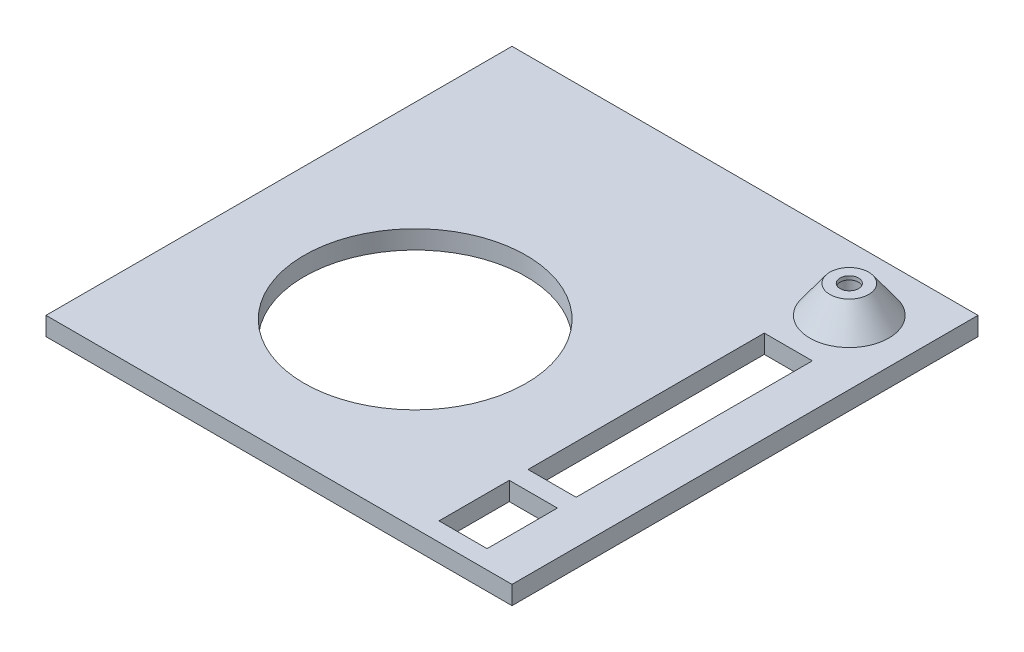
ISO-10303-21;
HEADER;
FILE_DESCRIPTION(('STEP AP214'),'2;1');
FILE_NAME('part.step','',(''),(''),'','','');
FILE_SCHEMA(('AUTOMOTIVE_DESIGN { 1 0 10303 214 1 1 1 1 }'));
ENDSEC;
DATA;
#1=APPLICATION_CONTEXT('core data for automotive mechanical design processes');
#2=APPLICATION_PROTOCOL_DEFINITION('international standard','automotive_design',2000,#1);
#3=PRODUCT_CONTEXT('',#1,'mechanical');
#4=PRODUCT('Part','Part','',(#3));
#5=PRODUCT_RELATED_PRODUCT_CATEGORY('part','',(#4));
#6=PRODUCT_DEFINITION_FORMATION('','',#4);
#7=PRODUCT_DEFINITION_CONTEXT('part definition',#1,'design');
#8=PRODUCT_DEFINITION('design','',#6,#7);
#9=PRODUCT_DEFINITION_SHAPE('','',#8);
#10=(LENGTH_UNIT() NAMED_UNIT(*) SI_UNIT(.MILLI.,.METRE.));
#11=(NAMED_UNIT(*) PLANE_ANGLE_UNIT() SI_UNIT($,.RADIAN.));
#12=(NAMED_UNIT(*) SI_UNIT($,.STERADIAN.) SOLID_ANGLE_UNIT());
#13=UNCERTAINTY_MEASURE_WITH_UNIT(LENGTH_MEASURE(1.E-05),#10,'distance_accuracy_value','');
#14=(GEOMETRIC_REPRESENTATION_CONTEXT(3) GLOBAL_UNCERTAINTY_ASSIGNED_CONTEXT((#13)) GLOBAL_UNIT_ASSIGNED_CONTEXT((#10,
#11,#12)) REPRESENTATION_CONTEXT('',''));
#15=CARTESIAN_POINT('',(0.,0.,0.));
#16=DIRECTION('',(0.,0.,1.));
#17=DIRECTION('',(1.,0.,0.));
#18=AXIS2_PLACEMENT_3D('',#15,#16,#17);
#19=CARTESIAN_POINT('',(0.,5.,0.));
#20=DIRECTION('',(0.,-1.,0.));
#21=DIRECTION('',(0.,0.,-1.));
#22=AXIS2_PLACEMENT_3D('',#19,#20,#21);
#23=PLANE('',#22);
#24=CARTESIAN_POINT('',(50.8371550320844,5.,-48.9745839886971));
#25=DIRECTION('',(0.,1.,0.));
#26=DIRECTION('',(0.,0.,1.));
#27=AXIS2_PLACEMENT_3D('',#24,#25,#26);
#28=CIRCLE('',#27,30.);
#29=CARTESIAN_POINT('',(50.8371550320844,5.,-18.9745839886971));
#30=VERTEX_POINT('',#29);
#31=EDGE_CURVE('E161',#30,#30,#28,.T.);
#32=ORIENTED_EDGE('',*,*,#31,.F.);
#33=EDGE_LOOP('',(#32));
#34=FACE_BOUND('',#33,.T.);
#35=DIRECTION('',(0.,0.,1.));
#36=VECTOR('',#35,1.);
#37=CARTESIAN_POINT('',(0.,5.,0.));
#38=LINE('',#37,#36);
#39=CARTESIAN_POINT('',(0.,5.,-126.));
#40=VERTEX_POINT('',#39);
#41=CARTESIAN_POINT('',(0.,5.,0.));
#42=VERTEX_POINT('',#41);
#43=EDGE_CURVE('E240',#40,#42,#38,.T.);
#44=ORIENTED_EDGE('',*,*,#43,.T.);
#45=DIRECTION('',(1.,0.,0.));
#46=VECTOR('',#45,1.);
#47=CARTESIAN_POINT('',(0.,5.,0.));
#48=LINE('',#47,#46);
#49=CARTESIAN_POINT('',(126.,5.,0.));
#50=VERTEX_POINT('',#49);
#51=EDGE_CURVE('E244',#42,#50,#48,.T.);
#52=ORIENTED_EDGE('',*,*,#51,.T.);
#53=DIRECTION('',(0.,0.,-1.));
#54=VECTOR('',#53,1.);
#55=CARTESIAN_POINT('',(126.,5.,0.));
#56=LINE('',#55,#54);
#57=CARTESIAN_POINT('',(126.,5.,-126.));
#58=VERTEX_POINT('',#57);
#59=EDGE_CURVE('E248',#50,#58,#56,.T.);
#60=ORIENTED_EDGE('',*,*,#59,.T.);
#61=DIRECTION('',(-1.,0.,0.));
#62=VECTOR('',#61,1.);
#63=CARTESIAN_POINT('',(0.,5.,-126.));
#64=LINE('',#63,#62);
#65=EDGE_CURVE('E251',#58,#40,#64,.T.);
#66=ORIENTED_EDGE('',*,*,#65,.T.);
#67=EDGE_LOOP('',(#44,#52,#60,#66));
#68=FACE_BOUND('',#67,.T.);
#69=CARTESIAN_POINT('',(108.6,5.,-108.6));
#70=DIRECTION('',(0.,-1.,0.));
#71=DIRECTION('',(0.,0.,-1.));
#72=AXIS2_PLACEMENT_3D('',#69,#70,#71);
#73=CIRCLE('',#72,10.6836436799865);
#74=CARTESIAN_POINT('',(108.6,5.,-119.283643679987));
#75=VERTEX_POINT('',#74);
#76=EDGE_CURVE('E11',#75,#75,#73,.T.);
#77=ORIENTED_EDGE('',*,*,#76,.T.);
#78=EDGE_LOOP('',(#77));
#79=FACE_BOUND('',#78,.T.);
#80=DIRECTION('',(0.,0.,1.));
#81=VECTOR('',#80,1.);
#82=CARTESIAN_POINT('',(101.263328315795,5.,0.));
#83=LINE('',#82,#81);
#84=CARTESIAN_POINT('',(101.263328315795,5.,-24.));
#85=VERTEX_POINT('',#84);
#86=CARTESIAN_POINT('',(101.263328315795,5.,-5.));
#87=VERTEX_POINT('',#86);
#88=EDGE_CURVE('E205',#85,#87,#83,.T.);
#89=ORIENTED_EDGE('',*,*,#88,.F.);
#90=DIRECTION('',(-1.,0.,0.));
#91=VECTOR('',#90,1.);
#92=CARTESIAN_POINT('',(0.,5.,-24.));
#93=LINE('',#92,#91);
#94=CARTESIAN_POINT('',(114.263328315795,5.,-24.));
#95=VERTEX_POINT('',#94);
#96=EDGE_CURVE('E65',#95,#85,#93,.T.);
#97=ORIENTED_EDGE('',*,*,#96,.F.);
#98=DIRECTION('',(0.,0.,1.));
#99=VECTOR('',#98,1.);
#100=CARTESIAN_POINT('',(114.263328315795,5.,0.));
#101=LINE('',#100,#99);
#102=CARTESIAN_POINT('',(114.263328315795,5.,-5.));
#103=VERTEX_POINT('',#102);
#104=EDGE_CURVE('E191',#95,#103,#101,.T.);
#105=ORIENTED_EDGE('',*,*,#104,.T.);
#106=DIRECTION('',(-1.,0.,0.));
#107=VECTOR('',#106,1.);
#108=CARTESIAN_POINT('',(0.,5.,-4.99999999999999));
#109=LINE('',#108,#107);
#110=EDGE_CURVE('E210',#103,#87,#109,.T.);
#111=ORIENTED_EDGE('',*,*,#110,.T.);
#112=EDGE_LOOP('',(#89,#97,#105,#111));
#113=FACE_BOUND('',#112,.T.);
#114=DIRECTION('',(0.,0.,-1.));
#115=VECTOR('',#114,1.);
#116=CARTESIAN_POINT('',(101.263328315795,5.,0.));
#117=LINE('',#116,#115);
#118=CARTESIAN_POINT('',(101.263328315795,5.,-29.06949502318));
#119=VERTEX_POINT('',#118);
#120=CARTESIAN_POINT('',(101.263328315795,5.,-92.9491679773942));
#121=VERTEX_POINT('',#120);
#122=EDGE_CURVE('E57',#119,#121,#117,.T.);
#123=ORIENTED_EDGE('',*,*,#122,.T.);
#124=DIRECTION('',(-1.,0.,0.));
#125=VECTOR('',#124,1.);
#126=CARTESIAN_POINT('',(0.,5.,-92.9491679773942));
#127=LINE('',#126,#125);
#128=CARTESIAN_POINT('',(114.263328315795,5.,-92.9491679773942));
#129=VERTEX_POINT('',#128);
#130=EDGE_CURVE('E154',#129,#121,#127,.T.);
#131=ORIENTED_EDGE('',*,*,#130,.F.);
#132=DIRECTION('',(0.,0.,-1.));
#133=VECTOR('',#132,1.);
#134=CARTESIAN_POINT('',(114.263328315795,5.,0.));
#135=LINE('',#134,#133);
#136=CARTESIAN_POINT('',(114.263328315795,5.,-29.06949502318));
#137=VERTEX_POINT('',#136);
#138=EDGE_CURVE('E158',#137,#129,#135,.T.);
#139=ORIENTED_EDGE('',*,*,#138,.F.);
#140=DIRECTION('',(-1.,0.,0.));
#141=VECTOR('',#140,1.);
#142=CARTESIAN_POINT('',(0.,5.,-29.06949502318));
#143=LINE('',#142,#141);
#144=EDGE_CURVE('E170',#137,#119,#143,.T.);
#145=ORIENTED_EDGE('',*,*,#144,.T.);
#146=EDGE_LOOP('',(#123,#131,#139,#145));
#147=FACE_BOUND('',#146,.T.);
#148=ADVANCED_FACE('F40',(#34,#68,#79,#113,#147),#23,.F.);
#149=CARTESIAN_POINT('',(0.,0.,0.));
#150=DIRECTION('',(0.,-1.,0.));
#151=DIRECTION('',(0.,0.,-1.));
#152=AXIS2_PLACEMENT_3D('',#149,#150,#151);
#153=PLANE('',#152);
#154=CARTESIAN_POINT('',(50.8371550320844,0.,-48.9745839886971));
#155=DIRECTION('',(0.,1.,0.));
#156=DIRECTION('',(0.,0.,1.));
#157=AXIS2_PLACEMENT_3D('',#154,#155,#156);
#158=CIRCLE('',#157,30.);
#159=CARTESIAN_POINT('',(50.8371550320844,0.,-18.9745839886971));
#160=VERTEX_POINT('',#159);
#161=EDGE_CURVE('E206',#160,#160,#158,.T.);
#162=ORIENTED_EDGE('',*,*,#161,.T.);
#163=EDGE_LOOP('',(#162));
#164=FACE_BOUND('',#163,.T.);
#165=DIRECTION('',(-1.,0.,0.));
#166=VECTOR('',#165,1.);
#167=CARTESIAN_POINT('',(0.,0.,-24.));
#168=LINE('',#167,#166);
#169=CARTESIAN_POINT('',(114.263328315795,0.,-24.));
#170=VERTEX_POINT('',#169);
#171=CARTESIAN_POINT('',(101.263328315795,0.,-24.));
#172=VERTEX_POINT('',#171);
#173=EDGE_CURVE('E186',#170,#172,#168,.T.);
#174=ORIENTED_EDGE('',*,*,#173,.T.);
#175=DIRECTION('',(0.,0.,1.));
#176=VECTOR('',#175,1.);
#177=CARTESIAN_POINT('',(101.263328315795,0.,0.));
#178=LINE('',#177,#176);
#179=CARTESIAN_POINT('',(101.263328315795,0.,-5.));
#180=VERTEX_POINT('',#179);
#181=EDGE_CURVE('E190',#172,#180,#178,.T.);
#182=ORIENTED_EDGE('',*,*,#181,.T.);
#183=DIRECTION('',(-1.,0.,0.));
#184=VECTOR('',#183,1.);
#185=CARTESIAN_POINT('',(0.,0.,-4.99999999999999));
#186=LINE('',#185,#184);
#187=CARTESIAN_POINT('',(114.263328315795,0.,-5.));
#188=VERTEX_POINT('',#187);
#189=EDGE_CURVE('E195',#188,#180,#186,.T.);
#190=ORIENTED_EDGE('',*,*,#189,.F.);
#191=DIRECTION('',(0.,0.,1.));
#192=VECTOR('',#191,1.);
#193=CARTESIAN_POINT('',(114.263328315795,0.,0.));
#194=LINE('',#193,#192);
#195=EDGE_CURVE('E199',#170,#188,#194,.T.);
#196=ORIENTED_EDGE('',*,*,#195,.F.);
#197=EDGE_LOOP('',(#174,#182,#190,#196));
#198=FACE_BOUND('',#197,.T.);
#199=CARTESIAN_POINT('',(108.6,0.,-108.6));
#200=DIRECTION('',(0.,-1.,0.));
#201=DIRECTION('',(0.,0.,-1.));
#202=AXIS2_PLACEMENT_3D('',#199,#200,#201);
#203=CIRCLE('',#202,2.95);
#204=CARTESIAN_POINT('',(108.6,0.,-111.55));
#205=VERTEX_POINT('',#204);
#206=EDGE_CURVE('E236',#205,#205,#203,.T.);
#207=ORIENTED_EDGE('',*,*,#206,.F.);
#208=EDGE_LOOP('',(#207));
#209=FACE_BOUND('',#208,.T.);
#210=DIRECTION('',(0.,0.,1.));
#211=VECTOR('',#210,1.);
#212=CARTESIAN_POINT('',(0.,0.,0.));
#213=LINE('',#212,#211);
#214=CARTESIAN_POINT('',(0.,0.,-126.));
#215=VERTEX_POINT('',#214);
#216=CARTESIAN_POINT('',(0.,0.,0.));
#217=VERTEX_POINT('',#216);
#218=EDGE_CURVE('E235',#215,#217,#213,.T.);
#219=ORIENTED_EDGE('',*,*,#218,.F.);
#220=DIRECTION('',(-1.,0.,0.));
#221=VECTOR('',#220,1.);
#222=CARTESIAN_POINT('',(0.,0.,-126.));
#223=LINE('',#222,#221);
#224=CARTESIAN_POINT('',(126.,0.,-126.));
#225=VERTEX_POINT('',#224);
#226=EDGE_CURVE('E245',#225,#215,#223,.T.);
#227=ORIENTED_EDGE('',*,*,#226,.F.);
#228=DIRECTION('',(0.,0.,-1.));
#229=VECTOR('',#228,1.);
#230=CARTESIAN_POINT('',(126.,0.,0.));
#231=LINE('',#230,#229);
#232=CARTESIAN_POINT('',(126.,0.,0.));
#233=VERTEX_POINT('',#232);
#234=EDGE_CURVE('E261',#233,#225,#231,.T.);
#235=ORIENTED_EDGE('',*,*,#234,.F.);
#236=DIRECTION('',(1.,0.,0.));
#237=VECTOR('',#236,1.);
#238=CARTESIAN_POINT('',(0.,0.,0.));
#239=LINE('',#238,#237);
#240=EDGE_CURVE('E258',#217,#233,#239,.T.);
#241=ORIENTED_EDGE('',*,*,#240,.F.);
#242=EDGE_LOOP('',(#219,#227,#235,#241));
#243=FACE_BOUND('',#242,.T.);
#244=DIRECTION('',(-1.,0.,0.));
#245=VECTOR('',#244,1.);
#246=CARTESIAN_POINT('',(0.,0.,-92.9491679773942));
#247=LINE('',#246,#245);
#248=CARTESIAN_POINT('',(114.263328315795,0.,-92.9491679773942));
#249=VERTEX_POINT('',#248);
#250=CARTESIAN_POINT('',(101.263328315795,0.,-92.9491679773942));
#251=VERTEX_POINT('',#250);
#252=EDGE_CURVE('E148',#249,#251,#247,.T.);
#253=ORIENTED_EDGE('',*,*,#252,.T.);
#254=DIRECTION('',(0.,0.,-1.));
#255=VECTOR('',#254,1.);
#256=CARTESIAN_POINT('',(101.263328315795,0.,0.));
#257=LINE('',#256,#255);
#258=CARTESIAN_POINT('',(101.263328315795,0.,-29.06949502318));
#259=VERTEX_POINT('',#258);
#260=EDGE_CURVE('E143',#259,#251,#257,.T.);
#261=ORIENTED_EDGE('',*,*,#260,.F.);
#262=DIRECTION('',(-1.,0.,0.));
#263=VECTOR('',#262,1.);
#264=CARTESIAN_POINT('',(0.,0.,-29.06949502318));
#265=LINE('',#264,#263);
#266=CARTESIAN_POINT('',(114.263328315795,0.,-29.06949502318));
#267=VERTEX_POINT('',#266);
#268=EDGE_CURVE('E132',#267,#259,#265,.T.);
#269=ORIENTED_EDGE('',*,*,#268,.F.);
#270=DIRECTION('',(0.,0.,-1.));
#271=VECTOR('',#270,1.);
#272=CARTESIAN_POINT('',(114.263328315795,0.,0.));
#273=LINE('',#272,#271);
#274=EDGE_CURVE('E142',#267,#249,#273,.T.);
#275=ORIENTED_EDGE('',*,*,#274,.T.);
#276=EDGE_LOOP('',(#253,#261,#269,#275));
#277=FACE_BOUND('',#276,.T.);
#278=ADVANCED_FACE('F151',(#164,#198,#209,#243,#277),#153,.T.);
#279=CARTESIAN_POINT('',(0.,5.,0.));
#280=DIRECTION('',(1.,0.,0.));
#281=DIRECTION('',(0.,0.,-1.));
#282=AXIS2_PLACEMENT_3D('',#279,#280,#281);
#283=PLANE('',#282);
#284=ORIENTED_EDGE('',*,*,#218,.T.);
#285=DIRECTION('',(0.,-1.,0.));
#286=VECTOR('',#285,1.);
#287=CARTESIAN_POINT('',(0.,5.,0.));
#288=LINE('',#287,#286);
#289=EDGE_CURVE('E277',#42,#217,#288,.T.);
#290=ORIENTED_EDGE('',*,*,#289,.F.);
#291=ORIENTED_EDGE('',*,*,#43,.F.);
#292=DIRECTION('',(0.,-1.,0.));
#293=VECTOR('',#292,1.);
#294=CARTESIAN_POINT('',(0.,5.,-126.));
#295=LINE('',#294,#293);
#296=EDGE_CURVE('E254',#40,#215,#295,.T.);
#297=ORIENTED_EDGE('',*,*,#296,.T.);
#298=EDGE_LOOP('',(#284,#290,#291,#297));
#299=FACE_BOUND('',#298,.T.);
#300=ADVANCED_FACE('F312',(#299),#283,.F.);
#301=CARTESIAN_POINT('',(0.,5.,0.));
#302=DIRECTION('',(0.,0.,-1.));
#303=DIRECTION('',(-1.,0.,0.));
#304=AXIS2_PLACEMENT_3D('',#301,#302,#303);
#305=PLANE('',#304);
#306=ORIENTED_EDGE('',*,*,#240,.T.);
#307=DIRECTION('',(0.,-1.,0.));
#308=VECTOR('',#307,1.);
#309=CARTESIAN_POINT('',(126.,5.,0.));
#310=LINE('',#309,#308);
#311=EDGE_CURVE('E273',#50,#233,#310,.T.);
#312=ORIENTED_EDGE('',*,*,#311,.F.);
#313=ORIENTED_EDGE('',*,*,#51,.F.);
#314=ORIENTED_EDGE('',*,*,#289,.T.);
#315=EDGE_LOOP('',(#306,#312,#313,#314));
#316=FACE_BOUND('',#315,.T.);
#317=ADVANCED_FACE('F327',(#316),#305,.F.);
#318=CARTESIAN_POINT('',(126.,5.,0.));
#319=DIRECTION('',(-1.,0.,0.));
#320=DIRECTION('',(0.,0.,1.));
#321=AXIS2_PLACEMENT_3D('',#318,#319,#320);
#322=PLANE('',#321);
#323=ORIENTED_EDGE('',*,*,#234,.T.);
#324=DIRECTION('',(0.,-1.,0.));
#325=VECTOR('',#324,1.);
#326=CARTESIAN_POINT('',(126.,5.,-126.));
#327=LINE('',#326,#325);
#328=EDGE_CURVE('E269',#58,#225,#327,.T.);
#329=ORIENTED_EDGE('',*,*,#328,.F.);
#330=ORIENTED_EDGE('',*,*,#59,.F.);
#331=ORIENTED_EDGE('',*,*,#311,.T.);
#332=EDGE_LOOP('',(#323,#329,#330,#331));
#333=FACE_BOUND('',#332,.T.);
#334=ADVANCED_FACE('F323',(#333),#322,.F.);
#335=CARTESIAN_POINT('',(0.,5.,-126.));
#336=DIRECTION('',(0.,0.,1.));
#337=DIRECTION('',(1.,0.,0.));
#338=AXIS2_PLACEMENT_3D('',#335,#336,#337);
#339=PLANE('',#338);
#340=ORIENTED_EDGE('',*,*,#226,.T.);
#341=ORIENTED_EDGE('',*,*,#296,.F.);
#342=ORIENTED_EDGE('',*,*,#65,.F.);
#343=ORIENTED_EDGE('',*,*,#328,.T.);
#344=EDGE_LOOP('',(#340,#341,#342,#343));
#345=FACE_BOUND('',#344,.T.);
#346=ADVANCED_FACE('F320',(#345),#339,.F.);
#347=CARTESIAN_POINT('',(108.6,12.5,-108.6));
#348=DIRECTION('',(0.,1.,0.));
#349=DIRECTION('',(0.,0.,1.));
#350=AXIS2_PLACEMENT_3D('',#347,#348,#349);
#351=PLANE('',#350);
#352=CARTESIAN_POINT('',(108.6,12.5,-108.6));
#353=DIRECTION('',(0.,1.,0.));
#354=DIRECTION('',(0.,0.,1.));
#355=AXIS2_PLACEMENT_3D('',#352,#353,#354);
#356=CIRCLE('',#355,5.23457471994626);
#357=CARTESIAN_POINT('',(108.6,12.5,-113.834574719946));
#358=VERTEX_POINT('',#357);
#359=EDGE_CURVE('E50',#358,#358,#356,.T.);
#360=ORIENTED_EDGE('',*,*,#359,.T.);
#361=EDGE_LOOP('',(#360));
#362=FACE_BOUND('',#361,.T.);
#363=CARTESIAN_POINT('',(108.6,12.5,-108.6));
#364=DIRECTION('',(0.,1.,0.));
#365=DIRECTION('',(0.,0.,1.));
#366=AXIS2_PLACEMENT_3D('',#363,#364,#365);
#367=CIRCLE('',#366,2.5);
#368=CARTESIAN_POINT('',(108.6,12.5,-106.1));
#369=VERTEX_POINT('',#368);
#370=EDGE_CURVE('E180',#369,#369,#367,.T.);
#371=ORIENTED_EDGE('',*,*,#370,.F.);
#372=EDGE_LOOP('',(#371));
#373=FACE_BOUND('',#372,.T.);
#374=ADVANCED_FACE('F287',(#362,#373),#351,.T.);
#375=CARTESIAN_POINT('',(108.6,11.5,-108.6));
#376=DIRECTION('',(0.,-1.,0.));
#377=DIRECTION('',(0.,0.,-1.));
#378=AXIS2_PLACEMENT_3D('',#375,#376,#377);
#379=CYLINDRICAL_SURFACE('',#378,2.95);
#380=CARTESIAN_POINT('',(108.6,11.5,-108.6));
#381=DIRECTION('',(0.,-1.,0.));
#382=DIRECTION('',(0.,0.,-1.));
#383=AXIS2_PLACEMENT_3D('',#380,#381,#382);
#384=CIRCLE('',#383,2.95);
#385=CARTESIAN_POINT('',(108.6,11.5,-111.55));
#386=VERTEX_POINT('',#385);
#387=EDGE_CURVE('E231',#386,#386,#384,.T.);
#388=ORIENTED_EDGE('',*,*,#387,.F.);
#389=EDGE_LOOP('',(#388));
#390=FACE_BOUND('',#389,.T.);
#391=ORIENTED_EDGE('',*,*,#206,.T.);
#392=EDGE_LOOP('',(#391));
#393=FACE_BOUND('',#392,.T.);
#394=ADVANCED_FACE('F381',(#390,#393),#379,.F.);
#395=CARTESIAN_POINT('',(108.6,11.5,-108.6));
#396=DIRECTION('',(0.,-1.,0.));
#397=DIRECTION('',(0.,0.,-1.));
#398=AXIS2_PLACEMENT_3D('',#395,#396,#397);
#399=PLANE('',#398);
#400=CARTESIAN_POINT('',(108.6,11.5,-108.6));
#401=DIRECTION('',(0.,-1.,0.));
#402=DIRECTION('',(0.,0.,-1.));
#403=AXIS2_PLACEMENT_3D('',#400,#401,#402);
#404=CIRCLE('',#403,2.5);
#405=CARTESIAN_POINT('',(108.6,11.5,-111.1));
#406=VERTEX_POINT('',#405);
#407=EDGE_CURVE('E230',#406,#406,#404,.T.);
#408=ORIENTED_EDGE('',*,*,#407,.F.);
#409=EDGE_LOOP('',(#408));
#410=FACE_BOUND('',#409,.T.);
#411=ORIENTED_EDGE('',*,*,#387,.T.);
#412=EDGE_LOOP('',(#411));
#413=FACE_BOUND('',#412,.T.);
#414=ADVANCED_FACE('F301',(#410,#413),#399,.T.);
#415=CARTESIAN_POINT('',(108.6,0.,-108.6));
#416=DIRECTION('',(0.,1.,0.));
#417=DIRECTION('',(0.,0.,1.));
#418=AXIS2_PLACEMENT_3D('',#415,#416,#417);
#419=CYLINDRICAL_SURFACE('',#418,2.5);
#420=ORIENTED_EDGE('',*,*,#407,.T.);
#421=EDGE_LOOP('',(#420));
#422=FACE_BOUND('',#421,.T.);
#423=ORIENTED_EDGE('',*,*,#370,.T.);
#424=EDGE_LOOP('',(#423));
#425=FACE_BOUND('',#424,.T.);
#426=ADVANCED_FACE('F292',(#422,#425),#419,.F.);
#427=CARTESIAN_POINT('',(108.6,12.5,-108.6));
#428=DIRECTION('',(0.,-1.,0.));
#429=DIRECTION('',(0.,0.,-1.));
#430=AXIS2_PLACEMENT_3D('',#427,#428,#429);
#431=CONICAL_SURFACE('',#430,5.23457471994626,0.628318530717965);
#432=CARTESIAN_POINT('',(108.6,5.,-119.283643679987));
#433=CARTESIAN_POINT('',(108.6,5.078125,-119.226882544986));
#434=CARTESIAN_POINT('',(108.6,5.15625,-119.170121409986));
#435=CARTESIAN_POINT('',(108.6,5.3125,-119.056599139985));
#436=CARTESIAN_POINT('',(108.6,5.390625,-118.999838004984));
#437=CARTESIAN_POINT('',(108.6,5.546875,-118.886315734984));
#438=CARTESIAN_POINT('',(108.6,5.625,-118.829554599983));
#439=CARTESIAN_POINT('',(108.6,5.78125,-118.716032329982));
#440=CARTESIAN_POINT('',(108.6,5.859375,-118.659271194982));
#441=CARTESIAN_POINT('',(108.6,6.015625,-118.545748924981));
#442=CARTESIAN_POINT('',(108.6,6.09375,-118.488987789981));
#443=CARTESIAN_POINT('',(108.6,6.25,-118.37546551998));
#444=CARTESIAN_POINT('',(108.6,6.328125,-118.318704384979));
#445=CARTESIAN_POINT('',(108.6,6.484375,-118.205182114979));
#446=CARTESIAN_POINT('',(108.6,6.5625,-118.148420979978));
#447=CARTESIAN_POINT('',(108.6,6.71875,-118.034898709977));
#448=CARTESIAN_POINT('',(108.6,6.796875,-117.978137574977));
#449=CARTESIAN_POINT('',(108.6,6.953125,-117.864615304976));
#450=CARTESIAN_POINT('',(108.6,7.03125,-117.807854169976));
#451=CARTESIAN_POINT('',(108.6,7.1875,-117.694331899975));
#452=CARTESIAN_POINT('',(108.6,7.265625,-117.637570764974));
#453=CARTESIAN_POINT('',(108.6,7.421875,-117.524048494974));
#454=CARTESIAN_POINT('',(108.6,7.5,-117.467287359973));
#455=CARTESIAN_POINT('',(108.6,7.65625,-117.353765089972));
#456=CARTESIAN_POINT('',(108.6,7.734375,-117.297003954972));
#457=CARTESIAN_POINT('',(108.6,7.890625,-117.183481684971));
#458=CARTESIAN_POINT('',(108.6,7.96875,-117.126720549971));
#459=CARTESIAN_POINT('',(108.6,8.125,-117.01319827997));
#460=CARTESIAN_POINT('',(108.6,8.203125,-116.956437144969));
#461=CARTESIAN_POINT('',(108.6,8.359375,-116.842914874968));
#462=CARTESIAN_POINT('',(108.6,8.4375,-116.786153739968));
#463=CARTESIAN_POINT('',(108.6,8.59375,-116.672631469967));
#464=CARTESIAN_POINT('',(108.6,8.671875,-116.615870334967));
#465=CARTESIAN_POINT('',(108.6,8.828125,-116.502348064966));
#466=CARTESIAN_POINT('',(108.6,8.90625,-116.445586929966));
#467=CARTESIAN_POINT('',(108.6,9.0625,-116.332064659965));
#468=CARTESIAN_POINT('',(108.6,9.140625,-116.275303524964));
#469=CARTESIAN_POINT('',(108.6,9.296875,-116.161781254963));
#470=CARTESIAN_POINT('',(108.6,9.375,-116.105020119963));
#471=CARTESIAN_POINT('',(108.6,9.53125,-115.991497849962));
#472=CARTESIAN_POINT('',(108.6,9.609375,-115.934736714962));
#473=CARTESIAN_POINT('',(108.6,9.765625,-115.821214444961));
#474=CARTESIAN_POINT('',(108.6,9.84375,-115.764453309961));
#475=CARTESIAN_POINT('',(108.6,10.,-115.65093103996));
#476=CARTESIAN_POINT('',(108.6,10.078125,-115.594169904959));
#477=CARTESIAN_POINT('',(108.6,10.234375,-115.480647634958));
#478=CARTESIAN_POINT('',(108.6,10.3125,-115.423886499958));
#479=CARTESIAN_POINT('',(108.6,10.46875,-115.310364229957));
#480=CARTESIAN_POINT('',(108.6,10.546875,-115.253603094957));
#481=CARTESIAN_POINT('',(108.6,10.703125,-115.140080824956));
#482=CARTESIAN_POINT('',(108.6,10.78125,-115.083319689955));
#483=CARTESIAN_POINT('',(108.6,10.9375,-114.969797419955));
#484=CARTESIAN_POINT('',(108.6,11.015625,-114.913036284954));
#485=CARTESIAN_POINT('',(108.6,11.171875,-114.799514014953));
#486=CARTESIAN_POINT('',(108.6,11.25,-114.742752879953));
#487=CARTESIAN_POINT('',(108.6,11.40625,-114.629230609952));
#488=CARTESIAN_POINT('',(108.6,11.484375,-114.572469474952));
#489=CARTESIAN_POINT('',(108.6,11.640625,-114.458947204951));
#490=CARTESIAN_POINT('',(108.6,11.71875,-114.40218606995));
#491=CARTESIAN_POINT('',(108.6,11.875,-114.28866379995));
#492=CARTESIAN_POINT('',(108.6,11.953125,-114.231902664949));
#493=CARTESIAN_POINT('',(108.6,12.109375,-114.118380394948));
#494=CARTESIAN_POINT('',(108.6,12.1875,-114.061619259948));
#495=CARTESIAN_POINT('',(108.6,12.34375,-113.948096989947));
#496=CARTESIAN_POINT('',(108.6,12.421875,-113.891335854947));
#497=CARTESIAN_POINT('',(108.6,12.5,-113.834574719946));
#498=B_SPLINE_CURVE_WITH_KNOTS('',3,(#432,#433,#434,#435,#436,#437,#438,#439,#440,#441,#442,
#443,#444,#445,#446,#447,#448,#449,#450,#451,#452,#453,#454,#455,#456,#457,#458,#459,#460,#461,
#462,#463,#464,#465,#466,#467,#468,#469,#470,#471,#472,#473,#474,#475,#476,#477,#478,#479,#480,
#481,#482,#483,#484,#485,#486,#487,#488,#489,#490,#491,#492,#493,#494,#495,#496,#497),
.UNSPECIFIED.,.F.,.F.,(4,2,2,2,2,2,2,2,2,2,2,2,2,2,2,2,2,2,2,2,2,2,2,2,2,2,2,2,2,2,2,2,4),(0.,
0.289703432226508,0.579406864453025,0.869110296679541,1.15881372890605,1.44851716113257,
1.73822059335908,2.0279240255856,2.31762745781211,2.60733089003862,2.89703432226514,
3.18673775449166,3.47644118671817,3.76614461894468,4.0558480511712,4.34555148339771,
4.63525491562423,4.92495834785074,5.21466178007725,5.50436521230377,5.79406864453029,
6.0837720767568,6.37347550898331,6.66317894120983,6.95288237343634,7.24258580566286,
7.53228923788937,7.82199267011588,8.1116961023424,8.40139953456892,8.69110296679543,
8.98080639902195,9.27050983124846),.UNSPECIFIED.);
#499=EDGE_CURVE('BSEAM43',#75,#358,#498,.T.);
#500=ORIENTED_EDGE('',*,*,#76,.F.);
#501=ORIENTED_EDGE('',*,*,#359,.F.);
#502=ORIENTED_EDGE('',*,*,#499,.T.);
#503=ORIENTED_EDGE('',*,*,#499,.F.);
#504=EDGE_LOOP('',(#500,#502,#501,#503));
#505=FACE_BOUND('',#504,.T.);
#506=ADVANCED_FACE('F43',(#505),#431,.T.);
#507=CARTESIAN_POINT('',(0.,0.,-24.));
#508=DIRECTION('',(0.,0.,-1.));
#509=DIRECTION('',(-1.,0.,0.));
#510=AXIS2_PLACEMENT_3D('',#507,#508,#509);
#511=PLANE('',#510);
#512=ORIENTED_EDGE('',*,*,#96,.T.);
#513=DIRECTION('',(0.,1.,0.));
#514=VECTOR('',#513,1.);
#515=CARTESIAN_POINT('',(101.263328315795,0.,-24.));
#516=LINE('',#515,#514);
#517=EDGE_CURVE('E202',#172,#85,#516,.T.);
#518=ORIENTED_EDGE('',*,*,#517,.F.);
#519=ORIENTED_EDGE('',*,*,#173,.F.);
#520=DIRECTION('',(0.,1.,0.));
#521=VECTOR('',#520,1.);
#522=CARTESIAN_POINT('',(114.263328315795,0.,-24.));
#523=LINE('',#522,#521);
#524=EDGE_CURVE('E171',#170,#95,#523,.T.);
#525=ORIENTED_EDGE('',*,*,#524,.T.);
#526=EDGE_LOOP('',(#512,#518,#519,#525));
#527=FACE_BOUND('',#526,.T.);
#528=ADVANCED_FACE('F291',(#527),#511,.F.);
#529=CARTESIAN_POINT('',(114.263328315795,0.,0.));
#530=DIRECTION('',(-1.,0.,0.));
#531=DIRECTION('',(0.,0.,1.));
#532=AXIS2_PLACEMENT_3D('',#529,#530,#531);
#533=PLANE('',#532);
#534=ORIENTED_EDGE('',*,*,#104,.F.);
#535=ORIENTED_EDGE('',*,*,#524,.F.);
#536=ORIENTED_EDGE('',*,*,#195,.T.);
#537=DIRECTION('',(0.,1.,0.));
#538=VECTOR('',#537,1.);
#539=CARTESIAN_POINT('',(114.263328315795,0.,-5.));
#540=LINE('',#539,#538);
#541=EDGE_CURVE('E219',#188,#103,#540,.T.);
#542=ORIENTED_EDGE('',*,*,#541,.T.);
#543=EDGE_LOOP('',(#534,#535,#536,#542));
#544=FACE_BOUND('',#543,.T.);
#545=ADVANCED_FACE('F299',(#544),#533,.T.);
#546=CARTESIAN_POINT('',(0.,0.,-4.99999999999999));
#547=DIRECTION('',(0.,0.,-1.));
#548=DIRECTION('',(-1.,0.,0.));
#549=AXIS2_PLACEMENT_3D('',#546,#547,#548);
#550=PLANE('',#549);
#551=ORIENTED_EDGE('',*,*,#110,.F.);
#552=ORIENTED_EDGE('',*,*,#541,.F.);
#553=ORIENTED_EDGE('',*,*,#189,.T.);
#554=DIRECTION('',(0.,1.,0.));
#555=VECTOR('',#554,1.);
#556=CARTESIAN_POINT('',(101.263328315795,0.,-5.));
#557=LINE('',#556,#555);
#558=EDGE_CURVE('E222',#180,#87,#557,.T.);
#559=ORIENTED_EDGE('',*,*,#558,.T.);
#560=EDGE_LOOP('',(#551,#552,#553,#559));
#561=FACE_BOUND('',#560,.T.);
#562=ADVANCED_FACE('F372',(#561),#550,.T.);
#563=CARTESIAN_POINT('',(101.263328315795,0.,0.));
#564=DIRECTION('',(-1.,0.,0.));
#565=DIRECTION('',(0.,0.,1.));
#566=AXIS2_PLACEMENT_3D('',#563,#564,#565);
#567=PLANE('',#566);
#568=ORIENTED_EDGE('',*,*,#88,.T.);
#569=ORIENTED_EDGE('',*,*,#558,.F.);
#570=ORIENTED_EDGE('',*,*,#181,.F.);
#571=ORIENTED_EDGE('',*,*,#517,.T.);
#572=EDGE_LOOP('',(#568,#569,#570,#571));
#573=FACE_BOUND('',#572,.T.);
#574=ADVANCED_FACE('F363',(#573),#567,.F.);
#575=CARTESIAN_POINT('',(101.263328315795,0.,0.));
#576=DIRECTION('',(1.,0.,0.));
#577=DIRECTION('',(0.,0.,-1.));
#578=AXIS2_PLACEMENT_3D('',#575,#576,#577);
#579=PLANE('',#578);
#580=ORIENTED_EDGE('',*,*,#122,.F.);
#581=DIRECTION('',(0.,1.,0.));
#582=VECTOR('',#581,1.);
#583=CARTESIAN_POINT('',(101.263328315795,0.,-29.06949502318));
#584=LINE('',#583,#582);
#585=EDGE_CURVE('E135',#259,#119,#584,.T.);
#586=ORIENTED_EDGE('',*,*,#585,.F.);
#587=ORIENTED_EDGE('',*,*,#260,.T.);
#588=DIRECTION('',(0.,1.,0.));
#589=VECTOR('',#588,1.);
#590=CARTESIAN_POINT('',(101.263328315795,0.,-92.9491679773942));
#591=LINE('',#590,#589);
#592=EDGE_CURVE('E177',#251,#121,#591,.T.);
#593=ORIENTED_EDGE('',*,*,#592,.T.);
#594=EDGE_LOOP('',(#580,#586,#587,#593));
#595=FACE_BOUND('',#594,.T.);
#596=ADVANCED_FACE('F145',(#595),#579,.T.);
#597=CARTESIAN_POINT('',(0.,0.,-92.9491679773942));
#598=DIRECTION('',(0.,0.,-1.));
#599=DIRECTION('',(-1.,0.,0.));
#600=AXIS2_PLACEMENT_3D('',#597,#598,#599);
#601=PLANE('',#600);
#602=ORIENTED_EDGE('',*,*,#130,.T.);
#603=ORIENTED_EDGE('',*,*,#592,.F.);
#604=ORIENTED_EDGE('',*,*,#252,.F.);
#605=DIRECTION('',(0.,1.,0.));
#606=VECTOR('',#605,1.);
#607=CARTESIAN_POINT('',(114.263328315795,0.,-92.9491679773942));
#608=LINE('',#607,#606);
#609=EDGE_CURVE('E181',#249,#129,#608,.T.);
#610=ORIENTED_EDGE('',*,*,#609,.T.);
#611=EDGE_LOOP('',(#602,#603,#604,#610));
#612=FACE_BOUND('',#611,.T.);
#613=ADVANCED_FACE('F355',(#612),#601,.F.);
#614=CARTESIAN_POINT('',(114.263328315795,0.,0.));
#615=DIRECTION('',(1.,0.,0.));
#616=DIRECTION('',(0.,0.,-1.));
#617=AXIS2_PLACEMENT_3D('',#614,#615,#616);
#618=PLANE('',#617);
#619=ORIENTED_EDGE('',*,*,#138,.T.);
#620=ORIENTED_EDGE('',*,*,#609,.F.);
#621=ORIENTED_EDGE('',*,*,#274,.F.);
#622=DIRECTION('',(0.,1.,0.));
#623=VECTOR('',#622,1.);
#624=CARTESIAN_POINT('',(114.263328315795,0.,-29.06949502318));
#625=LINE('',#624,#623);
#626=EDGE_CURVE('E137',#267,#137,#625,.T.);
#627=ORIENTED_EDGE('',*,*,#626,.T.);
#628=EDGE_LOOP('',(#619,#620,#621,#627));
#629=FACE_BOUND('',#628,.T.);
#630=ADVANCED_FACE('F353',(#629),#618,.F.);
#631=CARTESIAN_POINT('',(0.,0.,-29.06949502318));
#632=DIRECTION('',(0.,0.,-1.));
#633=DIRECTION('',(-1.,0.,0.));
#634=AXIS2_PLACEMENT_3D('',#631,#632,#633);
#635=PLANE('',#634);
#636=ORIENTED_EDGE('',*,*,#144,.F.);
#637=ORIENTED_EDGE('',*,*,#626,.F.);
#638=ORIENTED_EDGE('',*,*,#268,.T.);
#639=ORIENTED_EDGE('',*,*,#585,.T.);
#640=EDGE_LOOP('',(#636,#637,#638,#639));
#641=FACE_BOUND('',#640,.T.);
#642=ADVANCED_FACE('F134',(#641),#635,.T.);
#643=CARTESIAN_POINT('',(50.8371550320844,0.,-48.9745839886971));
#644=DIRECTION('',(0.,1.,0.));
#645=DIRECTION('',(0.,0.,1.));
#646=AXIS2_PLACEMENT_3D('',#643,#644,#645);
#647=CYLINDRICAL_SURFACE('',#646,30.);
#648=ORIENTED_EDGE('',*,*,#161,.F.);
#649=EDGE_LOOP('',(#648));
#650=FACE_BOUND('',#649,.T.);
#651=ORIENTED_EDGE('',*,*,#31,.T.);
#652=EDGE_LOOP('',(#651));
#653=FACE_BOUND('',#652,.T.);
#654=ADVANCED_FACE('F366',(#650,#653),#647,.F.);
#655=CLOSED_SHELL('',(#148,#278,#300,#317,#334,#346,#374,#394,#414,#426,#506,#528,#545,#562,
#574,#596,#613,#630,#642,#654));
#656=MANIFOLD_SOLID_BREP('B2',#655);
#657=ADVANCED_BREP_SHAPE_REPRESENTATION('',(#18,#656),#14);
#658=SHAPE_DEFINITION_REPRESENTATION(#9,#657);
ENDSEC;
END-ISO-10303-21;
